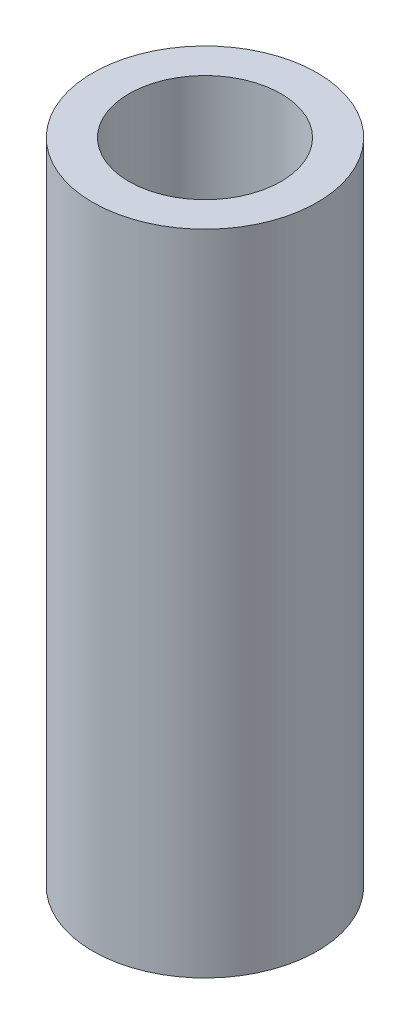
ISO-10303-21;
HEADER;
FILE_DESCRIPTION(('STEP AP214'),'2;1');
FILE_NAME('part.step','',(''),(''),'','','');
FILE_SCHEMA(('AUTOMOTIVE_DESIGN { 1 0 10303 214 1 1 1 1 }'));
ENDSEC;
DATA;
#1=APPLICATION_CONTEXT('core data for automotive mechanical design processes');
#2=APPLICATION_PROTOCOL_DEFINITION('international standard','automotive_design',2000,#1);
#3=PRODUCT_CONTEXT('',#1,'mechanical');
#4=PRODUCT('Part','Part','',(#3));
#5=PRODUCT_RELATED_PRODUCT_CATEGORY('part','',(#4));
#6=PRODUCT_DEFINITION_FORMATION('','',#4);
#7=PRODUCT_DEFINITION_CONTEXT('part definition',#1,'design');
#8=PRODUCT_DEFINITION('design','',#6,#7);
#9=PRODUCT_DEFINITION_SHAPE('','',#8);
#10=(LENGTH_UNIT() NAMED_UNIT(*) SI_UNIT(.MILLI.,.METRE.));
#11=(NAMED_UNIT(*) PLANE_ANGLE_UNIT() SI_UNIT($,.RADIAN.));
#12=(NAMED_UNIT(*) SI_UNIT($,.STERADIAN.) SOLID_ANGLE_UNIT());
#13=UNCERTAINTY_MEASURE_WITH_UNIT(LENGTH_MEASURE(1.E-05),#10,'distance_accuracy_value','');
#14=(GEOMETRIC_REPRESENTATION_CONTEXT(3) GLOBAL_UNCERTAINTY_ASSIGNED_CONTEXT((#13)) GLOBAL_UNIT_ASSIGNED_CONTEXT((#10,
#11,#12)) REPRESENTATION_CONTEXT('',''));
#15=CARTESIAN_POINT('',(0.,0.,0.));
#16=DIRECTION('',(0.,0.,1.));
#17=DIRECTION('',(1.,0.,0.));
#18=AXIS2_PLACEMENT_3D('',#15,#16,#17);
#19=CARTESIAN_POINT('',(0.,58.5381165593623,0.));
#20=DIRECTION('',(0.,1.,0.));
#21=DIRECTION('',(0.,0.,1.));
#22=AXIS2_PLACEMENT_3D('',#19,#20,#21);
#23=CYLINDRICAL_SURFACE('',#22,4.49999999999999);
#24=CARTESIAN_POINT('',(0.,-30.8016925534631,0.));
#25=DIRECTION('',(0.,1.,0.));
#26=DIRECTION('',(0.,0.,1.));
#27=AXIS2_PLACEMENT_3D('',#24,#25,#26);
#28=CIRCLE('',#27,4.49999999999999);
#29=CARTESIAN_POINT('',(0.,-30.8016925534631,4.49999999999999));
#30=VERTEX_POINT('',#29);
#31=EDGE_CURVE('E10',#30,#30,#28,.T.);
#32=ORIENTED_EDGE('',*,*,#31,.T.);
#33=EDGE_LOOP('',(#32));
#34=FACE_BOUND('',#33,.T.);
#35=CARTESIAN_POINT('',(0.,-4.8016925534631,0.));
#36=DIRECTION('',(0.,1.,0.));
#37=DIRECTION('',(0.,0.,1.));
#38=AXIS2_PLACEMENT_3D('',#35,#36,#37);
#39=CIRCLE('',#38,4.49999999999999);
#40=CARTESIAN_POINT('',(0.,-4.8016925534631,4.49999999999999));
#41=VERTEX_POINT('',#40);
#42=EDGE_CURVE('E46',#41,#41,#39,.T.);
#43=ORIENTED_EDGE('',*,*,#42,.F.);
#44=EDGE_LOOP('',(#43));
#45=FACE_BOUND('',#44,.T.);
#46=ADVANCED_FACE('F32',(#34,#45),#23,.T.);
#47=CARTESIAN_POINT('',(-3.04999999999999,-30.8016925534631,0.));
#48=DIRECTION('',(0.,-1.,0.));
#49=DIRECTION('',(0.,0.,-1.));
#50=AXIS2_PLACEMENT_3D('',#47,#48,#49);
#51=PLANE('',#50);
#52=CARTESIAN_POINT('',(0.,-30.8016925534631,0.));
#53=DIRECTION('',(0.,1.,0.));
#54=DIRECTION('',(0.,0.,1.));
#55=AXIS2_PLACEMENT_3D('',#52,#53,#54);
#56=CIRCLE('',#55,3.04999999999999);
#57=CARTESIAN_POINT('',(0.,-30.8016925534631,3.04999999999999));
#58=VERTEX_POINT('',#57);
#59=EDGE_CURVE('E38',#58,#58,#56,.T.);
#60=ORIENTED_EDGE('',*,*,#59,.T.);
#61=EDGE_LOOP('',(#60));
#62=FACE_BOUND('',#61,.T.);
#63=ORIENTED_EDGE('',*,*,#31,.F.);
#64=EDGE_LOOP('',(#63));
#65=FACE_BOUND('',#64,.T.);
#66=ADVANCED_FACE('F56',(#62,#65),#51,.T.);
#67=CARTESIAN_POINT('',(0.,58.5381165593623,0.));
#68=DIRECTION('',(0.,1.,0.));
#69=DIRECTION('',(0.,0.,1.));
#70=AXIS2_PLACEMENT_3D('',#67,#68,#69);
#71=CYLINDRICAL_SURFACE('',#70,3.04999999999999);
#72=CARTESIAN_POINT('',(0.,-4.8016925534631,0.));
#73=DIRECTION('',(0.,1.,0.));
#74=DIRECTION('',(0.,0.,1.));
#75=AXIS2_PLACEMENT_3D('',#72,#73,#74);
#76=CIRCLE('',#75,3.04999999999999);
#77=CARTESIAN_POINT('',(0.,-4.8016925534631,3.04999999999999));
#78=VERTEX_POINT('',#77);
#79=EDGE_CURVE('E42',#78,#78,#76,.T.);
#80=ORIENTED_EDGE('',*,*,#79,.T.);
#81=EDGE_LOOP('',(#80));
#82=FACE_BOUND('',#81,.T.);
#83=ORIENTED_EDGE('',*,*,#59,.F.);
#84=EDGE_LOOP('',(#83));
#85=FACE_BOUND('',#84,.T.);
#86=ADVANCED_FACE('F60',(#82,#85),#71,.F.);
#87=CARTESIAN_POINT('',(-3.04999999999999,-4.8016925534631,0.));
#88=DIRECTION('',(0.,1.,0.));
#89=DIRECTION('',(0.,0.,1.));
#90=AXIS2_PLACEMENT_3D('',#87,#88,#89);
#91=PLANE('',#90);
#92=ORIENTED_EDGE('',*,*,#42,.T.);
#93=EDGE_LOOP('',(#92));
#94=FACE_BOUND('',#93,.T.);
#95=ORIENTED_EDGE('',*,*,#79,.F.);
#96=EDGE_LOOP('',(#95));
#97=FACE_BOUND('',#96,.T.);
#98=ADVANCED_FACE('F52',(#94,#97),#91,.T.);
#99=CLOSED_SHELL('',(#46,#66,#86,#98));
#100=MANIFOLD_SOLID_BREP('B2',#99);
#101=ADVANCED_BREP_SHAPE_REPRESENTATION('',(#18,#100),#14);
#102=SHAPE_DEFINITION_REPRESENTATION(#9,#101);
ENDSEC;
END-ISO-10303-21;
